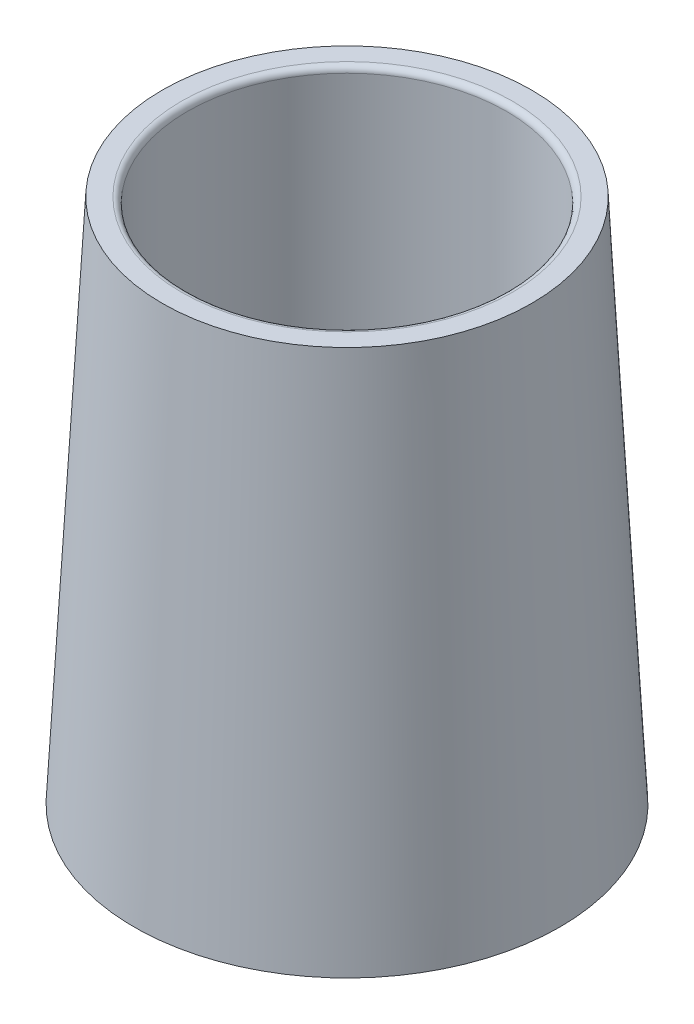
ISO-10303-21;
HEADER;
FILE_DESCRIPTION(('STEP AP214'),'2;1');
FILE_NAME('part.step','',(''),(''),'','','');
FILE_SCHEMA(('AUTOMOTIVE_DESIGN { 1 0 10303 214 1 1 1 1 }'));
ENDSEC;
DATA;
#1=APPLICATION_CONTEXT('core data for automotive mechanical design processes');
#2=APPLICATION_PROTOCOL_DEFINITION('international standard','automotive_design',2000,#1);
#3=PRODUCT_CONTEXT('',#1,'mechanical');
#4=PRODUCT('Part','Part','',(#3));
#5=PRODUCT_RELATED_PRODUCT_CATEGORY('part','',(#4));
#6=PRODUCT_DEFINITION_FORMATION('','',#4);
#7=PRODUCT_DEFINITION_CONTEXT('part definition',#1,'design');
#8=PRODUCT_DEFINITION('design','',#6,#7);
#9=PRODUCT_DEFINITION_SHAPE('','',#8);
#10=(LENGTH_UNIT() NAMED_UNIT(*) SI_UNIT(.MILLI.,.METRE.));
#11=(NAMED_UNIT(*) PLANE_ANGLE_UNIT() SI_UNIT($,.RADIAN.));
#12=(NAMED_UNIT(*) SI_UNIT($,.STERADIAN.) SOLID_ANGLE_UNIT());
#13=UNCERTAINTY_MEASURE_WITH_UNIT(LENGTH_MEASURE(1.E-05),#10,'distance_accuracy_value','');
#14=(GEOMETRIC_REPRESENTATION_CONTEXT(3) GLOBAL_UNCERTAINTY_ASSIGNED_CONTEXT((#13)) GLOBAL_UNIT_ASSIGNED_CONTEXT((#10,
#11,#12)) REPRESENTATION_CONTEXT('',''));
#15=CARTESIAN_POINT('',(0.,0.,0.));
#16=DIRECTION('',(0.,0.,1.));
#17=DIRECTION('',(1.,0.,0.));
#18=AXIS2_PLACEMENT_3D('',#15,#16,#17);
#19=CARTESIAN_POINT('',(0.,0.,0.));
#20=DIRECTION('',(0.,1.,0.));
#21=DIRECTION('',(-1.,0.,0.));
#22=AXIS2_PLACEMENT_3D('',#19,#20,#21);
#23=PLANE('',#22);
#24=CARTESIAN_POINT('',(0.,0.,0.));
#25=DIRECTION('',(0.,-1.,0.));
#26=DIRECTION('',(1.,0.,0.));
#27=AXIS2_PLACEMENT_3D('',#24,#25,#26);
#28=CIRCLE('',#27,28.9);
#29=CARTESIAN_POINT('',(28.9,0.,0.));
#30=VERTEX_POINT('',#29);
#31=EDGE_CURVE('E67',#30,#30,#28,.T.);
#32=ORIENTED_EDGE('',*,*,#31,.F.);
#33=EDGE_LOOP('',(#32));
#34=FACE_BOUND('',#33,.T.);
#35=CARTESIAN_POINT('',(0.,0.,0.));
#36=DIRECTION('',(0.,1.,0.));
#37=DIRECTION('',(-1.,0.,0.));
#38=AXIS2_PLACEMENT_3D('',#35,#36,#37);
#39=CIRCLE('',#38,36.);
#40=CARTESIAN_POINT('',(-36.,0.,0.));
#41=VERTEX_POINT('',#40);
#42=EDGE_CURVE('E57',#41,#41,#39,.T.);
#43=ORIENTED_EDGE('',*,*,#42,.F.);
#44=EDGE_LOOP('',(#43));
#45=FACE_BOUND('',#44,.T.);
#46=ADVANCED_FACE('F31',(#34,#45),#23,.F.);
#47=CARTESIAN_POINT('',(0.,0.,0.));
#48=DIRECTION('',(0.,-1.,0.));
#49=DIRECTION('',(1.,0.,0.));
#50=AXIS2_PLACEMENT_3D('',#47,#48,#49);
#51=CONICAL_SURFACE('',#50,36.,0.0533201984374761);
#52=CARTESIAN_POINT('',(0.,89.,0.));
#53=DIRECTION('',(0.,1.,0.));
#54=DIRECTION('',(-1.,0.,0.));
#55=AXIS2_PLACEMENT_3D('',#52,#53,#54);
#56=CIRCLE('',#55,31.25);
#57=CARTESIAN_POINT('',(-31.25,89.,0.));
#58=VERTEX_POINT('',#57);
#59=EDGE_CURVE('E60',#58,#58,#56,.T.);
#60=ORIENTED_EDGE('',*,*,#59,.F.);
#61=EDGE_LOOP('',(#60));
#62=FACE_BOUND('',#61,.T.);
#63=ORIENTED_EDGE('',*,*,#42,.T.);
#64=EDGE_LOOP('',(#63));
#65=FACE_BOUND('',#64,.T.);
#66=ADVANCED_FACE('F84',(#62,#65),#51,.T.);
#67=CARTESIAN_POINT('',(31.25,89.,0.));
#68=DIRECTION('',(0.,-1.,0.));
#69=DIRECTION('',(1.,0.,0.));
#70=AXIS2_PLACEMENT_3D('',#67,#68,#69);
#71=PLANE('',#70);
#72=CARTESIAN_POINT('',(0.,89.,0.));
#73=DIRECTION('',(0.,-1.,0.));
#74=DIRECTION('',(1.,0.,0.));
#75=AXIS2_PLACEMENT_3D('',#72,#73,#74);
#76=CIRCLE('',#75,28.);
#77=CARTESIAN_POINT('',(28.,89.,0.));
#78=VERTEX_POINT('',#77);
#79=EDGE_CURVE('E51',#78,#78,#76,.T.);
#80=ORIENTED_EDGE('',*,*,#79,.T.);
#81=EDGE_LOOP('',(#80));
#82=FACE_BOUND('',#81,.T.);
#83=ORIENTED_EDGE('',*,*,#59,.T.);
#84=EDGE_LOOP('',(#83));
#85=FACE_BOUND('',#84,.T.);
#86=ADVANCED_FACE('F89',(#82,#85),#71,.F.);
#87=CARTESIAN_POINT('',(0.,23.,0.));
#88=DIRECTION('',(0.,1.,0.));
#89=DIRECTION('',(-1.,0.,0.));
#90=AXIS2_PLACEMENT_3D('',#87,#88,#89);
#91=CYLINDRICAL_SURFACE('',#90,27.);
#92=CARTESIAN_POINT('',(0.,88.,0.));
#93=DIRECTION('',(0.,-1.,0.));
#94=DIRECTION('',(1.,0.,0.));
#95=AXIS2_PLACEMENT_3D('',#92,#93,#94);
#96=CIRCLE('',#95,27.);
#97=CARTESIAN_POINT('',(27.,88.,0.));
#98=VERTEX_POINT('',#97);
#99=EDGE_CURVE('E54',#98,#98,#96,.F.);
#100=ORIENTED_EDGE('',*,*,#99,.T.);
#101=EDGE_LOOP('',(#100));
#102=FACE_BOUND('',#101,.T.);
#103=CARTESIAN_POINT('',(0.,23.,0.));
#104=DIRECTION('',(0.,1.,0.));
#105=DIRECTION('',(-1.,0.,0.));
#106=AXIS2_PLACEMENT_3D('',#103,#104,#105);
#107=CIRCLE('',#106,27.);
#108=CARTESIAN_POINT('',(-27.,23.,0.));
#109=VERTEX_POINT('',#108);
#110=EDGE_CURVE('E63',#109,#109,#107,.T.);
#111=ORIENTED_EDGE('',*,*,#110,.F.);
#112=EDGE_LOOP('',(#111));
#113=FACE_BOUND('',#112,.T.);
#114=ADVANCED_FACE('F95',(#102,#113),#91,.F.);
#115=CARTESIAN_POINT('',(0.,23.,0.));
#116=DIRECTION('',(0.,1.,0.));
#117=DIRECTION('',(-1.,0.,0.));
#118=AXIS2_PLACEMENT_3D('',#115,#116,#117);
#119=PLANE('',#118);
#120=CARTESIAN_POINT('',(0.,23.,0.));
#121=DIRECTION('',(0.,1.,0.));
#122=DIRECTION('',(-1.,0.,0.));
#123=AXIS2_PLACEMENT_3D('',#120,#121,#122);
#124=CIRCLE('',#123,24.);
#125=CARTESIAN_POINT('',(-24.,23.,0.));
#126=VERTEX_POINT('',#125);
#127=EDGE_CURVE('E38',#126,#126,#124,.F.);
#128=ORIENTED_EDGE('',*,*,#127,.T.);
#129=EDGE_LOOP('',(#128));
#130=FACE_BOUND('',#129,.T.);
#131=ORIENTED_EDGE('',*,*,#110,.T.);
#132=EDGE_LOOP('',(#131));
#133=FACE_BOUND('',#132,.T.);
#134=ADVANCED_FACE('F78',(#130,#133),#119,.T.);
#135=CARTESIAN_POINT('',(0.,11.,0.));
#136=DIRECTION('',(0.,-1.,0.));
#137=DIRECTION('',(1.,0.,0.));
#138=AXIS2_PLACEMENT_3D('',#135,#136,#137);
#139=CYLINDRICAL_SURFACE('',#138,28.9);
#140=CARTESIAN_POINT('',(0.,11.,0.));
#141=DIRECTION('',(0.,-1.,0.));
#142=DIRECTION('',(1.,0.,0.));
#143=AXIS2_PLACEMENT_3D('',#140,#141,#142);
#144=CIRCLE('',#143,28.9);
#145=CARTESIAN_POINT('',(28.9,11.,0.));
#146=VERTEX_POINT('',#145);
#147=EDGE_CURVE('E66',#146,#146,#144,.T.);
#148=ORIENTED_EDGE('',*,*,#147,.F.);
#149=EDGE_LOOP('',(#148));
#150=FACE_BOUND('',#149,.T.);
#151=ORIENTED_EDGE('',*,*,#31,.T.);
#152=EDGE_LOOP('',(#151));
#153=FACE_BOUND('',#152,.T.);
#154=ADVANCED_FACE('F75',(#150,#153),#139,.F.);
#155=CARTESIAN_POINT('',(0.,11.,0.));
#156=DIRECTION('',(0.,-1.,0.));
#157=DIRECTION('',(1.,0.,0.));
#158=AXIS2_PLACEMENT_3D('',#155,#156,#157);
#159=PLANE('',#158);
#160=CARTESIAN_POINT('',(0.,11.,0.));
#161=DIRECTION('',(0.,-1.,0.));
#162=DIRECTION('',(1.,0.,0.));
#163=AXIS2_PLACEMENT_3D('',#160,#161,#162);
#164=CIRCLE('',#163,24.);
#165=CARTESIAN_POINT('',(24.,11.,0.));
#166=VERTEX_POINT('',#165);
#167=EDGE_CURVE('E10',#166,#166,#164,.F.);
#168=ORIENTED_EDGE('',*,*,#167,.T.);
#169=EDGE_LOOP('',(#168));
#170=FACE_BOUND('',#169,.T.);
#171=ORIENTED_EDGE('',*,*,#147,.T.);
#172=EDGE_LOOP('',(#171));
#173=FACE_BOUND('',#172,.T.);
#174=ADVANCED_FACE('F73',(#170,#173),#159,.T.);
#175=CARTESIAN_POINT('',(0.,89.,0.));
#176=DIRECTION('',(0.,-1.,0.));
#177=DIRECTION('',(1.,0.,0.));
#178=AXIS2_PLACEMENT_3D('',#175,#176,#177);
#179=CYLINDRICAL_SURFACE('',#178,23.);
#180=CARTESIAN_POINT('',(0.,22.,0.));
#181=DIRECTION('',(0.,1.,0.));
#182=DIRECTION('',(-1.,0.,0.));
#183=AXIS2_PLACEMENT_3D('',#180,#181,#182);
#184=CIRCLE('',#183,23.);
#185=CARTESIAN_POINT('',(-23.,22.,0.));
#186=VERTEX_POINT('',#185);
#187=EDGE_CURVE('E42',#186,#186,#184,.T.);
#188=ORIENTED_EDGE('',*,*,#187,.T.);
#189=EDGE_LOOP('',(#188));
#190=FACE_BOUND('',#189,.T.);
#191=CARTESIAN_POINT('',(0.,12.,0.));
#192=DIRECTION('',(0.,-1.,0.));
#193=DIRECTION('',(1.,0.,0.));
#194=AXIS2_PLACEMENT_3D('',#191,#192,#193);
#195=CIRCLE('',#194,23.);
#196=CARTESIAN_POINT('',(23.,12.,0.));
#197=VERTEX_POINT('',#196);
#198=EDGE_CURVE('E46',#197,#197,#195,.T.);
#199=ORIENTED_EDGE('',*,*,#198,.T.);
#200=EDGE_LOOP('',(#199));
#201=FACE_BOUND('',#200,.T.);
#202=ADVANCED_FACE('F104',(#190,#201),#179,.F.);
#203=CARTESIAN_POINT('',(0.,88.,0.));
#204=DIRECTION('',(0.,-1.,0.));
#205=DIRECTION('',(1.,0.,0.));
#206=AXIS2_PLACEMENT_3D('',#203,#204,#205);
#207=TOROIDAL_SURFACE('',#206,28.,1.);
#208=ORIENTED_EDGE('',*,*,#79,.F.);
#209=EDGE_LOOP('',(#208));
#210=FACE_BOUND('',#209,.T.);
#211=ORIENTED_EDGE('',*,*,#99,.F.);
#212=EDGE_LOOP('',(#211));
#213=FACE_BOUND('',#212,.T.);
#214=ADVANCED_FACE('F101',(#210,#213),#207,.T.);
#215=CARTESIAN_POINT('',(0.,22.,0.));
#216=DIRECTION('',(0.,1.,0.));
#217=DIRECTION('',(-1.,0.,0.));
#218=AXIS2_PLACEMENT_3D('',#215,#216,#217);
#219=TOROIDAL_SURFACE('',#218,24.,1.);
#220=ORIENTED_EDGE('',*,*,#127,.F.);
#221=EDGE_LOOP('',(#220));
#222=FACE_BOUND('',#221,.T.);
#223=ORIENTED_EDGE('',*,*,#187,.F.);
#224=EDGE_LOOP('',(#223));
#225=FACE_BOUND('',#224,.T.);
#226=ADVANCED_FACE('F103',(#222,#225),#219,.T.);
#227=CARTESIAN_POINT('',(0.,12.,0.));
#228=DIRECTION('',(0.,-1.,0.));
#229=DIRECTION('',(1.,0.,0.));
#230=AXIS2_PLACEMENT_3D('',#227,#228,#229);
#231=TOROIDAL_SURFACE('',#230,24.,1.);
#232=ORIENTED_EDGE('',*,*,#167,.F.);
#233=EDGE_LOOP('',(#232));
#234=FACE_BOUND('',#233,.T.);
#235=ORIENTED_EDGE('',*,*,#198,.F.);
#236=EDGE_LOOP('',(#235));
#237=FACE_BOUND('',#236,.T.);
#238=ADVANCED_FACE('F33',(#234,#237),#231,.T.);
#239=CLOSED_SHELL('',(#46,#66,#86,#114,#134,#154,#174,#202,#214,#226,#238));
#240=MANIFOLD_SOLID_BREP('B2',#239);
#241=ADVANCED_BREP_SHAPE_REPRESENTATION('',(#18,#240),#14);
#242=SHAPE_DEFINITION_REPRESENTATION(#9,#241);
ENDSEC;
END-ISO-10303-21;
